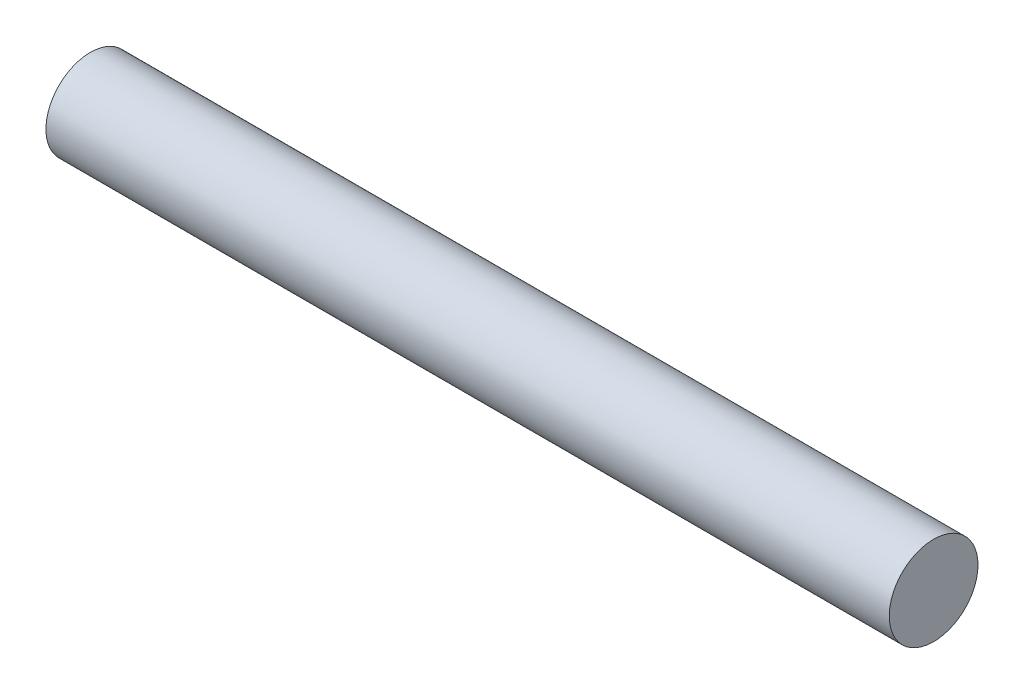
ISO-10303-21;
HEADER;
FILE_DESCRIPTION(('STEP AP214'),'2;1');
FILE_NAME('part.step','',(''),(''),'','','');
FILE_SCHEMA(('AUTOMOTIVE_DESIGN { 1 0 10303 214 1 1 1 1 }'));
ENDSEC;
DATA;
#1=APPLICATION_CONTEXT('core data for automotive mechanical design processes');
#2=APPLICATION_PROTOCOL_DEFINITION('international standard','automotive_design',2000,#1);
#3=PRODUCT_CONTEXT('',#1,'mechanical');
#4=PRODUCT('Part','Part','',(#3));
#5=PRODUCT_RELATED_PRODUCT_CATEGORY('part','',(#4));
#6=PRODUCT_DEFINITION_FORMATION('','',#4);
#7=PRODUCT_DEFINITION_CONTEXT('part definition',#1,'design');
#8=PRODUCT_DEFINITION('design','',#6,#7);
#9=PRODUCT_DEFINITION_SHAPE('','',#8);
#10=(LENGTH_UNIT() NAMED_UNIT(*) SI_UNIT(.MILLI.,.METRE.));
#11=(NAMED_UNIT(*) PLANE_ANGLE_UNIT() SI_UNIT($,.RADIAN.));
#12=(NAMED_UNIT(*) SI_UNIT($,.STERADIAN.) SOLID_ANGLE_UNIT());
#13=UNCERTAINTY_MEASURE_WITH_UNIT(LENGTH_MEASURE(1.E-05),#10,'distance_accuracy_value','');
#14=(GEOMETRIC_REPRESENTATION_CONTEXT(3) GLOBAL_UNCERTAINTY_ASSIGNED_CONTEXT((#13)) GLOBAL_UNIT_ASSIGNED_CONTEXT((#10,
#11,#12)) REPRESENTATION_CONTEXT('',''));
#15=CARTESIAN_POINT('',(0.,0.,0.));
#16=DIRECTION('',(0.,0.,1.));
#17=DIRECTION('',(1.,0.,0.));
#18=AXIS2_PLACEMENT_3D('',#15,#16,#17);
#19=CARTESIAN_POINT('',(380.,0.,0.));
#20=DIRECTION('',(-1.,0.,0.));
#21=DIRECTION('',(0.,0.,1.));
#22=AXIS2_PLACEMENT_3D('',#19,#20,#21);
#23=CYLINDRICAL_SURFACE('',#22,20.);
#24=CARTESIAN_POINT('',(380.,0.,0.));
#25=DIRECTION('',(1.,0.,0.));
#26=DIRECTION('',(0.,0.,-1.));
#27=AXIS2_PLACEMENT_3D('',#24,#25,#26);
#28=CIRCLE('',#27,20.);
#29=CARTESIAN_POINT('',(380.,0.,-20.));
#30=VERTEX_POINT('',#29);
#31=EDGE_CURVE('E10',#30,#30,#28,.T.);
#32=ORIENTED_EDGE('',*,*,#31,.F.);
#33=EDGE_LOOP('',(#32));
#34=FACE_BOUND('',#33,.T.);
#35=CARTESIAN_POINT('',(0.,0.,0.));
#36=DIRECTION('',(1.,0.,0.));
#37=DIRECTION('',(0.,0.,-1.));
#38=AXIS2_PLACEMENT_3D('',#35,#36,#37);
#39=CIRCLE('',#38,20.);
#40=CARTESIAN_POINT('',(0.,0.,-20.));
#41=VERTEX_POINT('',#40);
#42=EDGE_CURVE('E40',#41,#41,#39,.T.);
#43=ORIENTED_EDGE('',*,*,#42,.T.);
#44=EDGE_LOOP('',(#43));
#45=FACE_BOUND('',#44,.T.);
#46=ADVANCED_FACE('F37',(#34,#45),#23,.T.);
#47=CARTESIAN_POINT('',(380.,0.,0.));
#48=DIRECTION('',(1.,0.,0.));
#49=DIRECTION('',(0.,0.,-1.));
#50=AXIS2_PLACEMENT_3D('',#47,#48,#49);
#51=PLANE('',#50);
#52=ORIENTED_EDGE('',*,*,#31,.T.);
#53=EDGE_LOOP('',(#52));
#54=FACE_BOUND('',#53,.T.);
#55=ADVANCED_FACE('F54',(#54),#51,.T.);
#56=CARTESIAN_POINT('',(0.,0.,0.));
#57=DIRECTION('',(1.,0.,0.));
#58=DIRECTION('',(0.,0.,-1.));
#59=AXIS2_PLACEMENT_3D('',#56,#57,#58);
#60=PLANE('',#59);
#61=ORIENTED_EDGE('',*,*,#42,.F.);
#62=EDGE_LOOP('',(#61));
#63=FACE_BOUND('',#62,.T.);
#64=ADVANCED_FACE('F52',(#63),#60,.F.);
#65=CLOSED_SHELL('',(#46,#55,#64));
#66=MANIFOLD_SOLID_BREP('B2',#65);
#67=ADVANCED_BREP_SHAPE_REPRESENTATION('',(#18,#66),#14);
#68=SHAPE_DEFINITION_REPRESENTATION(#9,#67);
ENDSEC;
END-ISO-10303-21;
